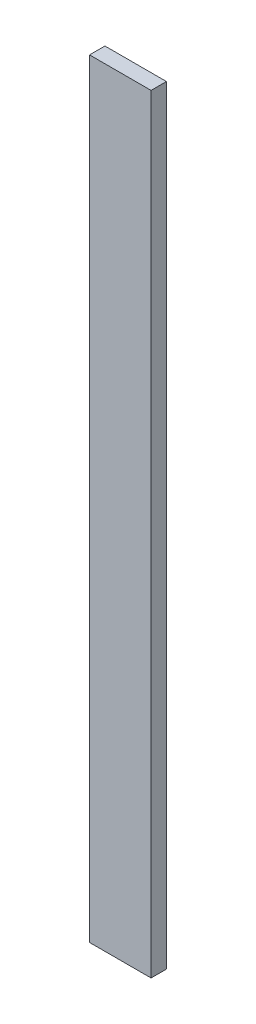
ISO-10303-21;
HEADER;
FILE_DESCRIPTION(('STEP AP214'),'2;1');
FILE_NAME('part.step','',(''),(''),'','','');
FILE_SCHEMA(('AUTOMOTIVE_DESIGN { 1 0 10303 214 1 1 1 1 }'));
ENDSEC;
DATA;
#1=APPLICATION_CONTEXT('core data for automotive mechanical design processes');
#2=APPLICATION_PROTOCOL_DEFINITION('international standard','automotive_design',2000,#1);
#3=PRODUCT_CONTEXT('',#1,'mechanical');
#4=PRODUCT('Part','Part','',(#3));
#5=PRODUCT_RELATED_PRODUCT_CATEGORY('part','',(#4));
#6=PRODUCT_DEFINITION_FORMATION('','',#4);
#7=PRODUCT_DEFINITION_CONTEXT('part definition',#1,'design');
#8=PRODUCT_DEFINITION('design','',#6,#7);
#9=PRODUCT_DEFINITION_SHAPE('','',#8);
#10=(LENGTH_UNIT() NAMED_UNIT(*) SI_UNIT(.MILLI.,.METRE.));
#11=(NAMED_UNIT(*) PLANE_ANGLE_UNIT() SI_UNIT($,.RADIAN.));
#12=(NAMED_UNIT(*) SI_UNIT($,.STERADIAN.) SOLID_ANGLE_UNIT());
#13=UNCERTAINTY_MEASURE_WITH_UNIT(LENGTH_MEASURE(1.E-05),#10,'distance_accuracy_value','');
#14=(GEOMETRIC_REPRESENTATION_CONTEXT(3) GLOBAL_UNCERTAINTY_ASSIGNED_CONTEXT((#13)) GLOBAL_UNIT_ASSIGNED_CONTEXT((#10,
#11,#12)) REPRESENTATION_CONTEXT('',''));
#15=CARTESIAN_POINT('',(0.,0.,0.));
#16=DIRECTION('',(0.,0.,1.));
#17=DIRECTION('',(1.,0.,0.));
#18=AXIS2_PLACEMENT_3D('',#15,#16,#17);
#19=CARTESIAN_POINT('',(10.,-125.,5.));
#20=DIRECTION('',(-1.,0.,0.));
#21=DIRECTION('',(0.,0.,1.));
#22=AXIS2_PLACEMENT_3D('',#19,#20,#21);
#23=PLANE('',#22);
#24=DIRECTION('',(0.,1.,0.));
#25=VECTOR('',#24,1.);
#26=CARTESIAN_POINT('',(10.,-125.,0.));
#27=LINE('',#26,#25);
#28=CARTESIAN_POINT('',(10.,-125.,0.));
#29=VERTEX_POINT('',#28);
#30=CARTESIAN_POINT('',(10.,125.,0.));
#31=VERTEX_POINT('',#30);
#32=EDGE_CURVE('E96',#29,#31,#27,.T.);
#33=ORIENTED_EDGE('',*,*,#32,.T.);
#34=DIRECTION('',(0.,0.,-1.));
#35=VECTOR('',#34,1.);
#36=CARTESIAN_POINT('',(10.,125.,5.));
#37=LINE('',#36,#35);
#38=CARTESIAN_POINT('',(10.,125.,5.));
#39=VERTEX_POINT('',#38);
#40=EDGE_CURVE('E11',#39,#31,#37,.T.);
#41=ORIENTED_EDGE('',*,*,#40,.F.);
#42=DIRECTION('',(0.,1.,0.));
#43=VECTOR('',#42,1.);
#44=CARTESIAN_POINT('',(10.,-125.,5.));
#45=LINE('',#44,#43);
#46=CARTESIAN_POINT('',(10.,-125.,5.));
#47=VERTEX_POINT('',#46);
#48=EDGE_CURVE('E84',#47,#39,#45,.T.);
#49=ORIENTED_EDGE('',*,*,#48,.F.);
#50=DIRECTION('',(0.,0.,-1.));
#51=VECTOR('',#50,1.);
#52=CARTESIAN_POINT('',(10.,-125.,5.));
#53=LINE('',#52,#51);
#54=EDGE_CURVE('E92',#47,#29,#53,.T.);
#55=ORIENTED_EDGE('',*,*,#54,.T.);
#56=EDGE_LOOP('',(#33,#41,#49,#55));
#57=FACE_BOUND('',#56,.T.);
#58=ADVANCED_FACE('F33',(#57),#23,.F.);
#59=CARTESIAN_POINT('',(-10.,125.,5.));
#60=DIRECTION('',(0.,-1.,0.));
#61=DIRECTION('',(0.,0.,-1.));
#62=AXIS2_PLACEMENT_3D('',#59,#60,#61);
#63=PLANE('',#62);
#64=DIRECTION('',(-1.,0.,0.));
#65=VECTOR('',#64,1.);
#66=CARTESIAN_POINT('',(-10.,125.,0.));
#67=LINE('',#66,#65);
#68=CARTESIAN_POINT('',(-10.,125.,0.));
#69=VERTEX_POINT('',#68);
#70=EDGE_CURVE('E88',#31,#69,#67,.T.);
#71=ORIENTED_EDGE('',*,*,#70,.T.);
#72=DIRECTION('',(0.,0.,-1.));
#73=VECTOR('',#72,1.);
#74=CARTESIAN_POINT('',(-10.,125.,5.));
#75=LINE('',#74,#73);
#76=CARTESIAN_POINT('',(-10.,125.,5.));
#77=VERTEX_POINT('',#76);
#78=EDGE_CURVE('E41',#77,#69,#75,.T.);
#79=ORIENTED_EDGE('',*,*,#78,.F.);
#80=DIRECTION('',(-1.,0.,0.));
#81=VECTOR('',#80,1.);
#82=CARTESIAN_POINT('',(-10.,125.,5.));
#83=LINE('',#82,#81);
#84=EDGE_CURVE('E79',#39,#77,#83,.T.);
#85=ORIENTED_EDGE('',*,*,#84,.F.);
#86=ORIENTED_EDGE('',*,*,#40,.T.);
#87=EDGE_LOOP('',(#71,#79,#85,#86));
#88=FACE_BOUND('',#87,.T.);
#89=ADVANCED_FACE('F87',(#88),#63,.F.);
#90=CARTESIAN_POINT('',(-10.,-125.,5.));
#91=DIRECTION('',(1.,0.,0.));
#92=DIRECTION('',(0.,0.,-1.));
#93=AXIS2_PLACEMENT_3D('',#90,#91,#92);
#94=PLANE('',#93);
#95=DIRECTION('',(0.,-1.,0.));
#96=VECTOR('',#95,1.);
#97=CARTESIAN_POINT('',(-10.,-125.,0.));
#98=LINE('',#97,#96);
#99=CARTESIAN_POINT('',(-10.,-125.,0.));
#100=VERTEX_POINT('',#99);
#101=EDGE_CURVE('E66',#69,#100,#98,.T.);
#102=ORIENTED_EDGE('',*,*,#101,.T.);
#103=DIRECTION('',(0.,0.,-1.));
#104=VECTOR('',#103,1.);
#105=CARTESIAN_POINT('',(-10.,-125.,5.));
#106=LINE('',#105,#104);
#107=CARTESIAN_POINT('',(-10.,-125.,5.));
#108=VERTEX_POINT('',#107);
#109=EDGE_CURVE('E89',#108,#100,#106,.T.);
#110=ORIENTED_EDGE('',*,*,#109,.F.);
#111=DIRECTION('',(0.,-1.,0.));
#112=VECTOR('',#111,1.);
#113=CARTESIAN_POINT('',(-10.,-125.,5.));
#114=LINE('',#113,#112);
#115=EDGE_CURVE('E82',#77,#108,#114,.T.);
#116=ORIENTED_EDGE('',*,*,#115,.F.);
#117=ORIENTED_EDGE('',*,*,#78,.T.);
#118=EDGE_LOOP('',(#102,#110,#116,#117));
#119=FACE_BOUND('',#118,.T.);
#120=ADVANCED_FACE('F90',(#119),#94,.F.);
#121=CARTESIAN_POINT('',(-10.,-125.,5.));
#122=DIRECTION('',(0.,1.,0.));
#123=DIRECTION('',(0.,0.,1.));
#124=AXIS2_PLACEMENT_3D('',#121,#122,#123);
#125=PLANE('',#124);
#126=DIRECTION('',(1.,0.,0.));
#127=VECTOR('',#126,1.);
#128=CARTESIAN_POINT('',(-10.,-125.,0.));
#129=LINE('',#128,#127);
#130=EDGE_CURVE('E72',#100,#29,#129,.T.);
#131=ORIENTED_EDGE('',*,*,#130,.T.);
#132=ORIENTED_EDGE('',*,*,#54,.F.);
#133=DIRECTION('',(1.,0.,0.));
#134=VECTOR('',#133,1.);
#135=CARTESIAN_POINT('',(-10.,-125.,5.));
#136=LINE('',#135,#134);
#137=EDGE_CURVE('E49',#108,#47,#136,.T.);
#138=ORIENTED_EDGE('',*,*,#137,.F.);
#139=ORIENTED_EDGE('',*,*,#109,.T.);
#140=EDGE_LOOP('',(#131,#132,#138,#139));
#141=FACE_BOUND('',#140,.T.);
#142=ADVANCED_FACE('F103',(#141),#125,.F.);
#143=CARTESIAN_POINT('',(0.,0.,5.));
#144=DIRECTION('',(0.,0.,-1.));
#145=DIRECTION('',(-1.,0.,0.));
#146=AXIS2_PLACEMENT_3D('',#143,#144,#145);
#147=PLANE('',#146);
#148=ORIENTED_EDGE('',*,*,#48,.T.);
#149=ORIENTED_EDGE('',*,*,#84,.T.);
#150=ORIENTED_EDGE('',*,*,#115,.T.);
#151=ORIENTED_EDGE('',*,*,#137,.T.);
#152=EDGE_LOOP('',(#148,#149,#150,#151));
#153=FACE_BOUND('',#152,.T.);
#154=ADVANCED_FACE('F80',(#153),#147,.F.);
#155=CARTESIAN_POINT('',(0.,0.,0.));
#156=DIRECTION('',(0.,0.,-1.));
#157=DIRECTION('',(-1.,0.,0.));
#158=AXIS2_PLACEMENT_3D('',#155,#156,#157);
#159=PLANE('',#158);
#160=ORIENTED_EDGE('',*,*,#32,.F.);
#161=ORIENTED_EDGE('',*,*,#130,.F.);
#162=ORIENTED_EDGE('',*,*,#101,.F.);
#163=ORIENTED_EDGE('',*,*,#70,.F.);
#164=EDGE_LOOP('',(#160,#161,#162,#163));
#165=FACE_BOUND('',#164,.T.);
#166=ADVANCED_FACE('F106',(#165),#159,.T.);
#167=CLOSED_SHELL('',(#58,#89,#120,#142,#154,#166));
#168=MANIFOLD_SOLID_BREP('B2',#167);
#169=ADVANCED_BREP_SHAPE_REPRESENTATION('',(#18,#168),#14);
#170=SHAPE_DEFINITION_REPRESENTATION(#9,#169);
ENDSEC;
END-ISO-10303-21;
